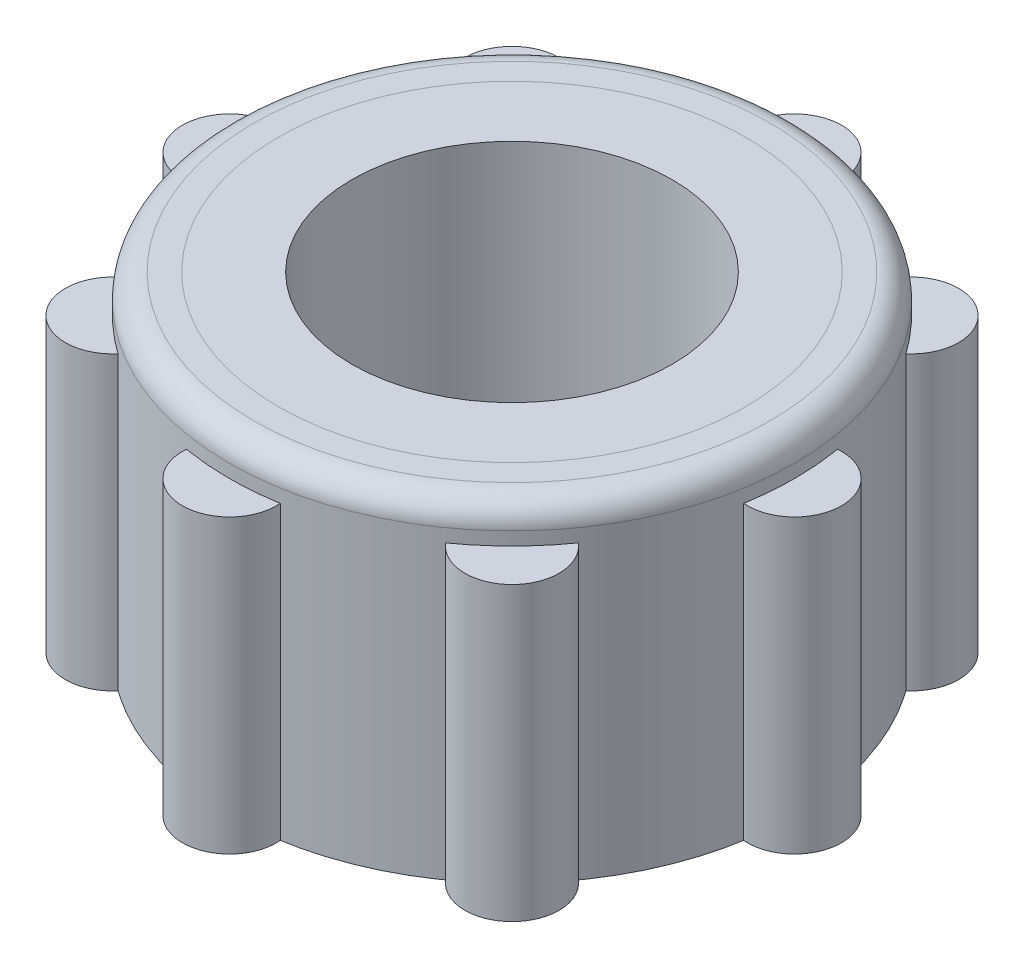
ISO-10303-21;
HEADER;
FILE_DESCRIPTION(('STEP AP214'),'2;1');
FILE_NAME('part.step','',(''),(''),'','','');
FILE_SCHEMA(('AUTOMOTIVE_DESIGN { 1 0 10303 214 1 1 1 1 }'));
ENDSEC;
DATA;
#1=APPLICATION_CONTEXT('core data for automotive mechanical design processes');
#2=APPLICATION_PROTOCOL_DEFINITION('international standard','automotive_design',2000,#1);
#3=PRODUCT_CONTEXT('',#1,'mechanical');
#4=PRODUCT('Part','Part','',(#3));
#5=PRODUCT_RELATED_PRODUCT_CATEGORY('part','',(#4));
#6=PRODUCT_DEFINITION_FORMATION('','',#4);
#7=PRODUCT_DEFINITION_CONTEXT('part definition',#1,'design');
#8=PRODUCT_DEFINITION('design','',#6,#7);
#9=PRODUCT_DEFINITION_SHAPE('','',#8);
#10=(LENGTH_UNIT() NAMED_UNIT(*) SI_UNIT(.MILLI.,.METRE.));
#11=(NAMED_UNIT(*) PLANE_ANGLE_UNIT() SI_UNIT($,.RADIAN.));
#12=(NAMED_UNIT(*) SI_UNIT($,.STERADIAN.) SOLID_ANGLE_UNIT());
#13=UNCERTAINTY_MEASURE_WITH_UNIT(LENGTH_MEASURE(1.E-05),#10,'distance_accuracy_value','');
#14=(GEOMETRIC_REPRESENTATION_CONTEXT(3) GLOBAL_UNCERTAINTY_ASSIGNED_CONTEXT((#13)) GLOBAL_UNIT_ASSIGNED_CONTEXT((#10,
#11,#12)) REPRESENTATION_CONTEXT('',''));
#15=CARTESIAN_POINT('',(0.,0.,0.));
#16=DIRECTION('',(0.,0.,1.));
#17=DIRECTION('',(1.,0.,0.));
#18=AXIS2_PLACEMENT_3D('',#15,#16,#17);
#19=CARTESIAN_POINT('',(0.,35.,0.));
#20=DIRECTION('',(0.,-1.,0.));
#21=DIRECTION('',(0.,0.,-1.));
#22=AXIS2_PLACEMENT_3D('',#19,#20,#21);
#23=CYLINDRICAL_SURFACE('',#22,17.);
#24=CARTESIAN_POINT('',(0.,35.,0.));
#25=DIRECTION('',(0.,1.,0.));
#26=DIRECTION('',(0.,0.,1.));
#27=AXIS2_PLACEMENT_3D('',#24,#25,#26);
#28=CIRCLE('',#27,17.);
#29=CARTESIAN_POINT('',(0.,35.,17.));
#30=VERTEX_POINT('',#29);
#31=EDGE_CURVE('E56',#30,#30,#28,.T.);
#32=ORIENTED_EDGE('',*,*,#31,.T.);
#33=EDGE_LOOP('',(#32));
#34=FACE_BOUND('',#33,.T.);
#35=CARTESIAN_POINT('',(0.,0.,0.));
#36=DIRECTION('',(0.,1.,0.));
#37=DIRECTION('',(0.,0.,1.));
#38=AXIS2_PLACEMENT_3D('',#35,#36,#37);
#39=CIRCLE('',#38,17.);
#40=CARTESIAN_POINT('',(0.,0.,17.));
#41=VERTEX_POINT('',#40);
#42=EDGE_CURVE('E63',#41,#41,#39,.T.);
#43=ORIENTED_EDGE('',*,*,#42,.F.);
#44=EDGE_LOOP('',(#43));
#45=FACE_BOUND('',#44,.T.);
#46=ADVANCED_FACE('F48',(#34,#45),#23,.F.);
#47=CARTESIAN_POINT('',(0.,35.,0.));
#48=DIRECTION('',(0.,-1.,0.));
#49=DIRECTION('',(0.,0.,-1.));
#50=AXIS2_PLACEMENT_3D('',#47,#48,#49);
#51=CYLINDRICAL_SURFACE('',#50,24.8);
#52=CARTESIAN_POINT('',(0.,35.,0.));
#53=DIRECTION('',(0.,1.,0.));
#54=DIRECTION('',(0.,0.,1.));
#55=AXIS2_PLACEMENT_3D('',#52,#53,#54);
#56=CIRCLE('',#55,24.8);
#57=CARTESIAN_POINT('',(0.,35.,24.8));
#58=VERTEX_POINT('',#57);
#59=EDGE_CURVE('E11',#58,#58,#56,.T.);
#60=ORIENTED_EDGE('',*,*,#59,.F.);
#61=EDGE_LOOP('',(#60));
#62=FACE_BOUND('',#61,.T.);
#63=CARTESIAN_POINT('',(0.,0.,0.));
#64=DIRECTION('',(0.,1.,0.));
#65=DIRECTION('',(0.,0.,1.));
#66=AXIS2_PLACEMENT_3D('',#63,#64,#65);
#67=CIRCLE('',#66,24.8);
#68=CARTESIAN_POINT('',(0.,0.,24.8));
#69=VERTEX_POINT('',#68);
#70=EDGE_CURVE('E51',#69,#69,#67,.T.);
#71=ORIENTED_EDGE('',*,*,#70,.T.);
#72=EDGE_LOOP('',(#71));
#73=FACE_BOUND('',#72,.T.);
#74=ADVANCED_FACE('F72',(#62,#73),#51,.T.);
#75=CARTESIAN_POINT('',(0.,35.,0.));
#76=DIRECTION('',(0.,1.,0.));
#77=DIRECTION('',(0.,0.,1.));
#78=AXIS2_PLACEMENT_3D('',#75,#76,#77);
#79=PLANE('',#78);
#80=ORIENTED_EDGE('',*,*,#31,.F.);
#81=EDGE_LOOP('',(#80));
#82=FACE_BOUND('',#81,.T.);
#83=ORIENTED_EDGE('',*,*,#59,.T.);
#84=EDGE_LOOP('',(#83));
#85=FACE_BOUND('',#84,.T.);
#86=ADVANCED_FACE('F76',(#82,#85),#79,.T.);
#87=CARTESIAN_POINT('',(0.,0.,0.));
#88=DIRECTION('',(0.,1.,0.));
#89=DIRECTION('',(0.,0.,1.));
#90=AXIS2_PLACEMENT_3D('',#87,#88,#89);
#91=PLANE('',#90);
#92=ORIENTED_EDGE('',*,*,#42,.T.);
#93=EDGE_LOOP('',(#92));
#94=FACE_BOUND('',#93,.T.);
#95=ORIENTED_EDGE('',*,*,#70,.F.);
#96=EDGE_LOOP('',(#95));
#97=FACE_BOUND('',#96,.T.);
#98=ADVANCED_FACE('F74',(#94,#97),#91,.F.);
#99=CLOSED_SHELL('',(#46,#74,#86,#98));
#100=MANIFOLD_SOLID_BREP('B2',#99);
#101=CARTESIAN_POINT('',(0.,31.,0.));
#102=DIRECTION('',(0.,-1.,0.));
#103=DIRECTION('',(0.,0.,-1.));
#104=AXIS2_PLACEMENT_3D('',#101,#102,#103);
#105=CYLINDRICAL_SURFACE('',#104,30.);
#106=CARTESIAN_POINT('',(0.,0.,0.));
#107=DIRECTION('',(0.,1.,0.));
#108=DIRECTION('',(0.,0.,1.));
#109=AXIS2_PLACEMENT_3D('',#106,#107,#108);
#110=CIRCLE('',#109,30.);
#111=CARTESIAN_POINT('',(-17.3953392506671,0.,-24.441811969537));
#112=VERTEX_POINT('',#111);
#113=CARTESIAN_POINT('',(-24.441811969537,0.,-17.395339250667));
#114=VERTEX_POINT('',#113);
#115=EDGE_CURVE('E152',#112,#114,#110,.T.);
#116=ORIENTED_EDGE('',*,*,#115,.F.);
#117=DIRECTION('',(0.,-1.,0.));
#118=VECTOR('',#117,1.);
#119=CARTESIAN_POINT('',(-17.3953392506671,31.,-24.441811969537));
#120=LINE('',#119,#118);
#121=CARTESIAN_POINT('',(-17.3953392506671,31.,-24.441811969537));
#122=VERTEX_POINT('',#121);
#123=EDGE_CURVE('E46',#122,#112,#120,.T.);
#124=ORIENTED_EDGE('',*,*,#123,.F.);
#125=CARTESIAN_POINT('',(0.,31.,0.));
#126=DIRECTION('',(0.,1.,0.));
#127=DIRECTION('',(0.,0.,1.));
#128=AXIS2_PLACEMENT_3D('',#125,#126,#127);
#129=CIRCLE('',#128,30.);
#130=CARTESIAN_POINT('',(-24.441811969537,31.,-17.395339250667));
#131=VERTEX_POINT('',#130);
#132=EDGE_CURVE('E153',#122,#131,#129,.T.);
#133=ORIENTED_EDGE('',*,*,#132,.T.);
#134=DIRECTION('',(0.,-1.,0.));
#135=VECTOR('',#134,1.);
#136=CARTESIAN_POINT('',(-24.441811969537,31.,-17.395339250667));
#137=LINE('',#136,#135);
#138=EDGE_CURVE('E132',#131,#114,#137,.T.);
#139=ORIENTED_EDGE('',*,*,#138,.T.);
#140=EDGE_LOOP('',(#116,#124,#133,#139));
#141=FACE_BOUND('',#140,.T.);
#142=ADVANCED_FACE('F124',(#141),#105,.F.);
#143=CARTESIAN_POINT('',(-21.2132034355965,31.,-21.2132034355964));
#144=DIRECTION('',(0.,-1.,0.));
#145=DIRECTION('',(0.,0.,-1.));
#146=AXIS2_PLACEMENT_3D('',#143,#144,#145);
#147=CYLINDRICAL_SURFACE('',#146,5.00000000000002);
#148=CARTESIAN_POINT('',(-21.2132034355965,0.,-21.2132034355964));
#149=DIRECTION('',(0.,1.,0.));
#150=DIRECTION('',(0.,0.,1.));
#151=AXIS2_PLACEMENT_3D('',#148,#149,#150);
#152=CIRCLE('',#151,5.00000000000002);
#153=EDGE_CURVE('E154',#112,#114,#152,.T.);
#154=ORIENTED_EDGE('',*,*,#153,.T.);
#155=ORIENTED_EDGE('',*,*,#138,.F.);
#156=CARTESIAN_POINT('',(-21.2132034355965,31.,-21.2132034355964));
#157=DIRECTION('',(0.,1.,0.));
#158=DIRECTION('',(0.,0.,1.));
#159=AXIS2_PLACEMENT_3D('',#156,#157,#158);
#160=CIRCLE('',#159,5.00000000000002);
#161=EDGE_CURVE('E139',#122,#131,#160,.T.);
#162=ORIENTED_EDGE('',*,*,#161,.F.);
#163=ORIENTED_EDGE('',*,*,#123,.T.);
#164=EDGE_LOOP('',(#154,#155,#162,#163));
#165=FACE_BOUND('',#164,.T.);
#166=ADVANCED_FACE('F155',(#165),#147,.T.);
#167=CARTESIAN_POINT('',(0.,31.,0.));
#168=DIRECTION('',(0.,1.,0.));
#169=DIRECTION('',(0.,0.,1.));
#170=AXIS2_PLACEMENT_3D('',#167,#168,#169);
#171=PLANE('',#170);
#172=ORIENTED_EDGE('',*,*,#132,.F.);
#173=ORIENTED_EDGE('',*,*,#161,.T.);
#174=EDGE_LOOP('',(#172,#173));
#175=FACE_BOUND('',#174,.T.);
#176=ADVANCED_FACE('F163',(#175),#171,.T.);
#177=CARTESIAN_POINT('',(0.,0.,0.));
#178=DIRECTION('',(0.,1.,0.));
#179=DIRECTION('',(0.,0.,1.));
#180=AXIS2_PLACEMENT_3D('',#177,#178,#179);
#181=PLANE('',#180);
#182=ORIENTED_EDGE('',*,*,#115,.T.);
#183=ORIENTED_EDGE('',*,*,#153,.F.);
#184=EDGE_LOOP('',(#182,#183));
#185=FACE_BOUND('',#184,.T.);
#186=ADVANCED_FACE('F158',(#185),#181,.F.);
#187=CLOSED_SHELL('',(#142,#166,#176,#186));
#188=MANIFOLD_SOLID_BREP('B6',#187);
#189=CARTESIAN_POINT('',(0.,31.,0.));
#190=DIRECTION('',(0.,-1.,0.));
#191=DIRECTION('',(0.,0.,-1.));
#192=AXIS2_PLACEMENT_3D('',#189,#190,#191);
#193=CYLINDRICAL_SURFACE('',#192,30.);
#194=CARTESIAN_POINT('',(0.,0.,0.));
#195=DIRECTION('',(0.,1.,0.));
#196=DIRECTION('',(0.,0.,1.));
#197=AXIS2_PLACEMENT_3D('',#194,#195,#196);
#198=CIRCLE('',#197,30.);
#199=CARTESIAN_POINT('',(-29.5833333333333,0.,-4.98260864295883));
#200=VERTEX_POINT('',#199);
#201=CARTESIAN_POINT('',(-29.5833333333333,0.,4.98260864295904));
#202=VERTEX_POINT('',#201);
#203=EDGE_CURVE('E243',#200,#202,#198,.T.);
#204=ORIENTED_EDGE('',*,*,#203,.F.);
#205=DIRECTION('',(0.,-1.,0.));
#206=VECTOR('',#205,1.);
#207=CARTESIAN_POINT('',(-29.5833333333333,31.,-4.98260864295883));
#208=LINE('',#207,#206);
#209=CARTESIAN_POINT('',(-29.5833333333333,31.,-4.98260864295883));
#210=VERTEX_POINT('',#209);
#211=EDGE_CURVE('E122',#210,#200,#208,.T.);
#212=ORIENTED_EDGE('',*,*,#211,.F.);
#213=CARTESIAN_POINT('',(0.,31.,0.));
#214=DIRECTION('',(0.,1.,0.));
#215=DIRECTION('',(0.,0.,1.));
#216=AXIS2_PLACEMENT_3D('',#213,#214,#215);
#217=CIRCLE('',#216,30.);
#218=CARTESIAN_POINT('',(-29.5833333333333,31.,4.98260864295904));
#219=VERTEX_POINT('',#218);
#220=EDGE_CURVE('E244',#210,#219,#217,.T.);
#221=ORIENTED_EDGE('',*,*,#220,.T.);
#222=DIRECTION('',(0.,-1.,0.));
#223=VECTOR('',#222,1.);
#224=CARTESIAN_POINT('',(-29.5833333333333,31.,4.98260864295904));
#225=LINE('',#224,#223);
#226=EDGE_CURVE('E223',#219,#202,#225,.T.);
#227=ORIENTED_EDGE('',*,*,#226,.T.);
#228=EDGE_LOOP('',(#204,#212,#221,#227));
#229=FACE_BOUND('',#228,.T.);
#230=ADVANCED_FACE('F215',(#229),#193,.F.);
#231=CARTESIAN_POINT('',(-30.,31.,1.04744440165294E-13));
#232=DIRECTION('',(0.,-1.,0.));
#233=DIRECTION('',(0.,0.,-1.));
#234=AXIS2_PLACEMENT_3D('',#231,#232,#233);
#235=CYLINDRICAL_SURFACE('',#234,5.00000000000002);
#236=CARTESIAN_POINT('',(-30.,0.,1.04744440165294E-13));
#237=DIRECTION('',(0.,1.,0.));
#238=DIRECTION('',(0.,0.,1.));
#239=AXIS2_PLACEMENT_3D('',#236,#237,#238);
#240=CIRCLE('',#239,5.00000000000002);
#241=EDGE_CURVE('E245',#200,#202,#240,.T.);
#242=ORIENTED_EDGE('',*,*,#241,.T.);
#243=ORIENTED_EDGE('',*,*,#226,.F.);
#244=CARTESIAN_POINT('',(-30.,31.,1.04744440165294E-13));
#245=DIRECTION('',(0.,1.,0.));
#246=DIRECTION('',(0.,0.,1.));
#247=AXIS2_PLACEMENT_3D('',#244,#245,#246);
#248=CIRCLE('',#247,5.00000000000002);
#249=EDGE_CURVE('E230',#210,#219,#248,.T.);
#250=ORIENTED_EDGE('',*,*,#249,.F.);
#251=ORIENTED_EDGE('',*,*,#211,.T.);
#252=EDGE_LOOP('',(#242,#243,#250,#251));
#253=FACE_BOUND('',#252,.T.);
#254=ADVANCED_FACE('F246',(#253),#235,.T.);
#255=CARTESIAN_POINT('',(0.,31.,0.));
#256=DIRECTION('',(0.,1.,0.));
#257=DIRECTION('',(0.,0.,1.));
#258=AXIS2_PLACEMENT_3D('',#255,#256,#257);
#259=PLANE('',#258);
#260=ORIENTED_EDGE('',*,*,#220,.F.);
#261=ORIENTED_EDGE('',*,*,#249,.T.);
#262=EDGE_LOOP('',(#260,#261));
#263=FACE_BOUND('',#262,.T.);
#264=ADVANCED_FACE('F254',(#263),#259,.T.);
#265=CARTESIAN_POINT('',(0.,0.,0.));
#266=DIRECTION('',(0.,1.,0.));
#267=DIRECTION('',(0.,0.,1.));
#268=AXIS2_PLACEMENT_3D('',#265,#266,#267);
#269=PLANE('',#268);
#270=ORIENTED_EDGE('',*,*,#203,.T.);
#271=ORIENTED_EDGE('',*,*,#241,.F.);
#272=EDGE_LOOP('',(#270,#271));
#273=FACE_BOUND('',#272,.T.);
#274=ADVANCED_FACE('F249',(#273),#269,.F.);
#275=CLOSED_SHELL('',(#230,#254,#264,#274));
#276=MANIFOLD_SOLID_BREP('B40',#275);
#277=CARTESIAN_POINT('',(0.,31.,0.));
#278=DIRECTION('',(0.,-1.,0.));
#279=DIRECTION('',(0.,0.,-1.));
#280=AXIS2_PLACEMENT_3D('',#277,#278,#279);
#281=CYLINDRICAL_SURFACE('',#280,30.);
#282=CARTESIAN_POINT('',(0.,0.,0.));
#283=DIRECTION('',(0.,1.,0.));
#284=DIRECTION('',(0.,0.,1.));
#285=AXIS2_PLACEMENT_3D('',#282,#283,#284);
#286=CIRCLE('',#285,30.);
#287=CARTESIAN_POINT('',(4.98260864295894,0.,-29.5833333333333));
#288=VERTEX_POINT('',#287);
#289=CARTESIAN_POINT('',(-4.98260864295894,0.,-29.5833333333333));
#290=VERTEX_POINT('',#289);
#291=EDGE_CURVE('E334',#288,#290,#286,.T.);
#292=ORIENTED_EDGE('',*,*,#291,.F.);
#293=DIRECTION('',(0.,-1.,0.));
#294=VECTOR('',#293,1.);
#295=CARTESIAN_POINT('',(4.98260864295894,31.,-29.5833333333333));
#296=LINE('',#295,#294);
#297=CARTESIAN_POINT('',(4.98260864295894,31.,-29.5833333333333));
#298=VERTEX_POINT('',#297);
#299=EDGE_CURVE('E213',#298,#288,#296,.T.);
#300=ORIENTED_EDGE('',*,*,#299,.F.);
#301=CARTESIAN_POINT('',(0.,31.,0.));
#302=DIRECTION('',(0.,1.,0.));
#303=DIRECTION('',(0.,0.,1.));
#304=AXIS2_PLACEMENT_3D('',#301,#302,#303);
#305=CIRCLE('',#304,30.);
#306=CARTESIAN_POINT('',(-4.98260864295894,31.,-29.5833333333333));
#307=VERTEX_POINT('',#306);
#308=EDGE_CURVE('E335',#298,#307,#305,.T.);
#309=ORIENTED_EDGE('',*,*,#308,.T.);
#310=DIRECTION('',(0.,-1.,0.));
#311=VECTOR('',#310,1.);
#312=CARTESIAN_POINT('',(-4.98260864295894,31.,-29.5833333333333));
#313=LINE('',#312,#311);
#314=EDGE_CURVE('E314',#307,#290,#313,.T.);
#315=ORIENTED_EDGE('',*,*,#314,.T.);
#316=EDGE_LOOP('',(#292,#300,#309,#315));
#317=FACE_BOUND('',#316,.T.);
#318=ADVANCED_FACE('F306',(#317),#281,.F.);
#319=CARTESIAN_POINT('',(0.,31.,-30.));
#320=DIRECTION('',(0.,-1.,0.));
#321=DIRECTION('',(0.,0.,-1.));
#322=AXIS2_PLACEMENT_3D('',#319,#320,#321);
#323=CYLINDRICAL_SURFACE('',#322,5.00000000000002);
#324=CARTESIAN_POINT('',(0.,0.,-30.));
#325=DIRECTION('',(0.,1.,0.));
#326=DIRECTION('',(0.,0.,1.));
#327=AXIS2_PLACEMENT_3D('',#324,#325,#326);
#328=CIRCLE('',#327,5.00000000000002);
#329=EDGE_CURVE('E336',#288,#290,#328,.T.);
#330=ORIENTED_EDGE('',*,*,#329,.T.);
#331=ORIENTED_EDGE('',*,*,#314,.F.);
#332=CARTESIAN_POINT('',(0.,31.,-30.));
#333=DIRECTION('',(0.,1.,0.));
#334=DIRECTION('',(0.,0.,1.));
#335=AXIS2_PLACEMENT_3D('',#332,#333,#334);
#336=CIRCLE('',#335,5.00000000000002);
#337=EDGE_CURVE('E321',#298,#307,#336,.T.);
#338=ORIENTED_EDGE('',*,*,#337,.F.);
#339=ORIENTED_EDGE('',*,*,#299,.T.);
#340=EDGE_LOOP('',(#330,#331,#338,#339));
#341=FACE_BOUND('',#340,.T.);
#342=ADVANCED_FACE('F337',(#341),#323,.T.);
#343=CARTESIAN_POINT('',(0.,31.,0.));
#344=DIRECTION('',(0.,1.,0.));
#345=DIRECTION('',(0.,0.,1.));
#346=AXIS2_PLACEMENT_3D('',#343,#344,#345);
#347=PLANE('',#346);
#348=ORIENTED_EDGE('',*,*,#308,.F.);
#349=ORIENTED_EDGE('',*,*,#337,.T.);
#350=EDGE_LOOP('',(#348,#349));
#351=FACE_BOUND('',#350,.T.);
#352=ADVANCED_FACE('F345',(#351),#347,.T.);
#353=CARTESIAN_POINT('',(0.,0.,0.));
#354=DIRECTION('',(0.,1.,0.));
#355=DIRECTION('',(0.,0.,1.));
#356=AXIS2_PLACEMENT_3D('',#353,#354,#355);
#357=PLANE('',#356);
#358=ORIENTED_EDGE('',*,*,#291,.T.);
#359=ORIENTED_EDGE('',*,*,#329,.F.);
#360=EDGE_LOOP('',(#358,#359));
#361=FACE_BOUND('',#360,.T.);
#362=ADVANCED_FACE('F340',(#361),#357,.F.);
#363=CLOSED_SHELL('',(#318,#342,#352,#362));
#364=MANIFOLD_SOLID_BREP('B116',#363);
#365=CARTESIAN_POINT('',(0.,31.,0.));
#366=DIRECTION('',(0.,-1.,0.));
#367=DIRECTION('',(0.,0.,-1.));
#368=AXIS2_PLACEMENT_3D('',#365,#366,#367);
#369=CYLINDRICAL_SURFACE('',#368,30.);
#370=CARTESIAN_POINT('',(0.,0.,0.));
#371=DIRECTION('',(0.,1.,0.));
#372=DIRECTION('',(0.,0.,1.));
#373=AXIS2_PLACEMENT_3D('',#370,#371,#372);
#374=CIRCLE('',#373,30.);
#375=CARTESIAN_POINT('',(-24.4418119695371,0.,17.3953392506668));
#376=VERTEX_POINT('',#375);
#377=CARTESIAN_POINT('',(-17.3953392506673,0.,24.4418119695368));
#378=VERTEX_POINT('',#377);
#379=EDGE_CURVE('E425',#376,#378,#374,.T.);
#380=ORIENTED_EDGE('',*,*,#379,.F.);
#381=DIRECTION('',(0.,-1.,0.));
#382=VECTOR('',#381,1.);
#383=CARTESIAN_POINT('',(-24.4418119695371,31.,17.3953392506668));
#384=LINE('',#383,#382);
#385=CARTESIAN_POINT('',(-24.4418119695371,31.,17.3953392506668));
#386=VERTEX_POINT('',#385);
#387=EDGE_CURVE('E304',#386,#376,#384,.T.);
#388=ORIENTED_EDGE('',*,*,#387,.F.);
#389=CARTESIAN_POINT('',(0.,31.,0.));
#390=DIRECTION('',(0.,1.,0.));
#391=DIRECTION('',(0.,0.,1.));
#392=AXIS2_PLACEMENT_3D('',#389,#390,#391);
#393=CIRCLE('',#392,30.);
#394=CARTESIAN_POINT('',(-17.3953392506673,31.,24.4418119695368));
#395=VERTEX_POINT('',#394);
#396=EDGE_CURVE('E426',#386,#395,#393,.T.);
#397=ORIENTED_EDGE('',*,*,#396,.T.);
#398=DIRECTION('',(0.,-1.,0.));
#399=VECTOR('',#398,1.);
#400=CARTESIAN_POINT('',(-17.3953392506673,31.,24.4418119695368));
#401=LINE('',#400,#399);
#402=EDGE_CURVE('E405',#395,#378,#401,.T.);
#403=ORIENTED_EDGE('',*,*,#402,.T.);
#404=EDGE_LOOP('',(#380,#388,#397,#403));
#405=FACE_BOUND('',#404,.T.);
#406=ADVANCED_FACE('F397',(#405),#369,.F.);
#407=CARTESIAN_POINT('',(-21.2132034355966,31.,21.2132034355962));
#408=DIRECTION('',(0.,-1.,0.));
#409=DIRECTION('',(0.,0.,-1.));
#410=AXIS2_PLACEMENT_3D('',#407,#408,#409);
#411=CYLINDRICAL_SURFACE('',#410,5.00000000000002);
#412=CARTESIAN_POINT('',(-21.2132034355966,0.,21.2132034355962));
#413=DIRECTION('',(0.,1.,0.));
#414=DIRECTION('',(0.,0.,1.));
#415=AXIS2_PLACEMENT_3D('',#412,#413,#414);
#416=CIRCLE('',#415,5.00000000000002);
#417=EDGE_CURVE('E427',#376,#378,#416,.T.);
#418=ORIENTED_EDGE('',*,*,#417,.T.);
#419=ORIENTED_EDGE('',*,*,#402,.F.);
#420=CARTESIAN_POINT('',(-21.2132034355966,31.,21.2132034355962));
#421=DIRECTION('',(0.,1.,0.));
#422=DIRECTION('',(0.,0.,1.));
#423=AXIS2_PLACEMENT_3D('',#420,#421,#422);
#424=CIRCLE('',#423,5.00000000000002);
#425=EDGE_CURVE('E412',#386,#395,#424,.T.);
#426=ORIENTED_EDGE('',*,*,#425,.F.);
#427=ORIENTED_EDGE('',*,*,#387,.T.);
#428=EDGE_LOOP('',(#418,#419,#426,#427));
#429=FACE_BOUND('',#428,.T.);
#430=ADVANCED_FACE('F428',(#429),#411,.T.);
#431=CARTESIAN_POINT('',(0.,31.,0.));
#432=DIRECTION('',(0.,1.,0.));
#433=DIRECTION('',(0.,0.,1.));
#434=AXIS2_PLACEMENT_3D('',#431,#432,#433);
#435=PLANE('',#434);
#436=ORIENTED_EDGE('',*,*,#396,.F.);
#437=ORIENTED_EDGE('',*,*,#425,.T.);
#438=EDGE_LOOP('',(#436,#437));
#439=FACE_BOUND('',#438,.T.);
#440=ADVANCED_FACE('F436',(#439),#435,.T.);
#441=CARTESIAN_POINT('',(0.,0.,0.));
#442=DIRECTION('',(0.,1.,0.));
#443=DIRECTION('',(0.,0.,1.));
#444=AXIS2_PLACEMENT_3D('',#441,#442,#443);
#445=PLANE('',#444);
#446=ORIENTED_EDGE('',*,*,#379,.T.);
#447=ORIENTED_EDGE('',*,*,#417,.F.);
#448=EDGE_LOOP('',(#446,#447));
#449=FACE_BOUND('',#448,.T.);
#450=ADVANCED_FACE('F431',(#449),#445,.F.);
#451=CLOSED_SHELL('',(#406,#430,#440,#450));
#452=MANIFOLD_SOLID_BREP('B207',#451);
#453=CARTESIAN_POINT('',(0.,31.,0.));
#454=DIRECTION('',(0.,-1.,0.));
#455=DIRECTION('',(0.,0.,-1.));
#456=AXIS2_PLACEMENT_3D('',#453,#454,#455);
#457=CYLINDRICAL_SURFACE('',#456,30.);
#458=CARTESIAN_POINT('',(0.,0.,0.));
#459=DIRECTION('',(0.,1.,0.));
#460=DIRECTION('',(0.,0.,1.));
#461=AXIS2_PLACEMENT_3D('',#458,#459,#460);
#462=CIRCLE('',#461,30.);
#463=CARTESIAN_POINT('',(24.4418119695369,0.,-17.3953392506672));
#464=VERTEX_POINT('',#463);
#465=CARTESIAN_POINT('',(17.395339250667,0.,-24.4418119695371));
#466=VERTEX_POINT('',#465);
#467=EDGE_CURVE('E516',#464,#466,#462,.T.);
#468=ORIENTED_EDGE('',*,*,#467,.F.);
#469=DIRECTION('',(0.,-1.,0.));
#470=VECTOR('',#469,1.);
#471=CARTESIAN_POINT('',(24.4418119695369,31.,-17.3953392506672));
#472=LINE('',#471,#470);
#473=CARTESIAN_POINT('',(24.4418119695369,31.,-17.3953392506672));
#474=VERTEX_POINT('',#473);
#475=EDGE_CURVE('E395',#474,#464,#472,.T.);
#476=ORIENTED_EDGE('',*,*,#475,.F.);
#477=CARTESIAN_POINT('',(0.,31.,0.));
#478=DIRECTION('',(0.,1.,0.));
#479=DIRECTION('',(0.,0.,1.));
#480=AXIS2_PLACEMENT_3D('',#477,#478,#479);
#481=CIRCLE('',#480,30.);
#482=CARTESIAN_POINT('',(17.395339250667,31.,-24.4418119695371));
#483=VERTEX_POINT('',#482);
#484=EDGE_CURVE('E517',#474,#483,#481,.T.);
#485=ORIENTED_EDGE('',*,*,#484,.T.);
#486=DIRECTION('',(0.,-1.,0.));
#487=VECTOR('',#486,1.);
#488=CARTESIAN_POINT('',(17.395339250667,31.,-24.4418119695371));
#489=LINE('',#488,#487);
#490=EDGE_CURVE('E496',#483,#466,#489,.T.);
#491=ORIENTED_EDGE('',*,*,#490,.T.);
#492=EDGE_LOOP('',(#468,#476,#485,#491));
#493=FACE_BOUND('',#492,.T.);
#494=ADVANCED_FACE('F488',(#493),#457,.F.);
#495=CARTESIAN_POINT('',(21.2132034355957,31.,-21.2132034355959));
#496=DIRECTION('',(0.,-1.,0.));
#497=DIRECTION('',(0.,0.,-1.));
#498=AXIS2_PLACEMENT_3D('',#495,#496,#497);
#499=CYLINDRICAL_SURFACE('',#498,4.99999999999995);
#500=CARTESIAN_POINT('',(21.2132034355957,0.,-21.2132034355959));
#501=DIRECTION('',(0.,1.,0.));
#502=DIRECTION('',(0.,0.,1.));
#503=AXIS2_PLACEMENT_3D('',#500,#501,#502);
#504=CIRCLE('',#503,4.99999999999995);
#505=EDGE_CURVE('E518',#464,#466,#504,.T.);
#506=ORIENTED_EDGE('',*,*,#505,.T.);
#507=ORIENTED_EDGE('',*,*,#490,.F.);
#508=CARTESIAN_POINT('',(21.2132034355957,31.,-21.2132034355959));
#509=DIRECTION('',(0.,1.,0.));
#510=DIRECTION('',(0.,0.,1.));
#511=AXIS2_PLACEMENT_3D('',#508,#509,#510);
#512=CIRCLE('',#511,4.99999999999995);
#513=EDGE_CURVE('E503',#474,#483,#512,.T.);
#514=ORIENTED_EDGE('',*,*,#513,.F.);
#515=ORIENTED_EDGE('',*,*,#475,.T.);
#516=EDGE_LOOP('',(#506,#507,#514,#515));
#517=FACE_BOUND('',#516,.T.);
#518=ADVANCED_FACE('F519',(#517),#499,.T.);
#519=CARTESIAN_POINT('',(0.,31.,0.));
#520=DIRECTION('',(0.,1.,0.));
#521=DIRECTION('',(0.,0.,1.));
#522=AXIS2_PLACEMENT_3D('',#519,#520,#521);
#523=PLANE('',#522);
#524=ORIENTED_EDGE('',*,*,#484,.F.);
#525=ORIENTED_EDGE('',*,*,#513,.T.);
#526=EDGE_LOOP('',(#524,#525));
#527=FACE_BOUND('',#526,.T.);
#528=ADVANCED_FACE('F527',(#527),#523,.T.);
#529=CARTESIAN_POINT('',(0.,0.,0.));
#530=DIRECTION('',(0.,1.,0.));
#531=DIRECTION('',(0.,0.,1.));
#532=AXIS2_PLACEMENT_3D('',#529,#530,#531);
#533=PLANE('',#532);
#534=ORIENTED_EDGE('',*,*,#467,.T.);
#535=ORIENTED_EDGE('',*,*,#505,.F.);
#536=EDGE_LOOP('',(#534,#535));
#537=FACE_BOUND('',#536,.T.);
#538=ADVANCED_FACE('F522',(#537),#533,.F.);
#539=CLOSED_SHELL('',(#494,#518,#528,#538));
#540=MANIFOLD_SOLID_BREP('B298',#539);
#541=CARTESIAN_POINT('',(0.,31.,0.));
#542=DIRECTION('',(0.,-1.,0.));
#543=DIRECTION('',(0.,0.,-1.));
#544=AXIS2_PLACEMENT_3D('',#541,#542,#543);
#545=CYLINDRICAL_SURFACE('',#544,30.);
#546=CARTESIAN_POINT('',(0.,0.,0.));
#547=DIRECTION('',(0.,1.,0.));
#548=DIRECTION('',(0.,0.,1.));
#549=AXIS2_PLACEMENT_3D('',#546,#547,#548);
#550=CIRCLE('',#549,30.);
#551=CARTESIAN_POINT('',(29.5833333333333,0.,4.98260864295919));
#552=VERTEX_POINT('',#551);
#553=CARTESIAN_POINT('',(29.5833333333334,0.,-4.98260864295869));
#554=VERTEX_POINT('',#553);
#555=EDGE_CURVE('E607',#552,#554,#550,.T.);
#556=ORIENTED_EDGE('',*,*,#555,.F.);
#557=DIRECTION('',(0.,-1.,0.));
#558=VECTOR('',#557,1.);
#559=CARTESIAN_POINT('',(29.5833333333333,31.,4.98260864295919));
#560=LINE('',#559,#558);
#561=CARTESIAN_POINT('',(29.5833333333333,31.,4.98260864295919));
#562=VERTEX_POINT('',#561);
#563=EDGE_CURVE('E486',#562,#552,#560,.T.);
#564=ORIENTED_EDGE('',*,*,#563,.F.);
#565=CARTESIAN_POINT('',(0.,31.,0.));
#566=DIRECTION('',(0.,1.,0.));
#567=DIRECTION('',(0.,0.,1.));
#568=AXIS2_PLACEMENT_3D('',#565,#566,#567);
#569=CIRCLE('',#568,30.);
#570=CARTESIAN_POINT('',(29.5833333333334,31.,-4.98260864295869));
#571=VERTEX_POINT('',#570);
#572=EDGE_CURVE('E608',#562,#571,#569,.T.);
#573=ORIENTED_EDGE('',*,*,#572,.T.);
#574=DIRECTION('',(0.,-1.,0.));
#575=VECTOR('',#574,1.);
#576=CARTESIAN_POINT('',(29.5833333333334,31.,-4.98260864295869));
#577=LINE('',#576,#575);
#578=EDGE_CURVE('E587',#571,#554,#577,.T.);
#579=ORIENTED_EDGE('',*,*,#578,.T.);
#580=EDGE_LOOP('',(#556,#564,#573,#579));
#581=FACE_BOUND('',#580,.T.);
#582=ADVANCED_FACE('F579',(#581),#545,.F.);
#583=CARTESIAN_POINT('',(29.9999999999982,31.,2.55016460767879E-13));
#584=DIRECTION('',(0.,-1.,0.));
#585=DIRECTION('',(0.,0.,-1.));
#586=AXIS2_PLACEMENT_3D('',#583,#584,#585);
#587=CYLINDRICAL_SURFACE('',#586,4.99999999999987);
#588=CARTESIAN_POINT('',(29.9999999999982,0.,2.55016460767879E-13));
#589=DIRECTION('',(0.,1.,0.));
#590=DIRECTION('',(0.,0.,1.));
#591=AXIS2_PLACEMENT_3D('',#588,#589,#590);
#592=CIRCLE('',#591,4.99999999999987);
#593=EDGE_CURVE('E609',#552,#554,#592,.T.);
#594=ORIENTED_EDGE('',*,*,#593,.T.);
#595=ORIENTED_EDGE('',*,*,#578,.F.);
#596=CARTESIAN_POINT('',(29.9999999999982,31.,2.55016460767879E-13));
#597=DIRECTION('',(0.,1.,0.));
#598=DIRECTION('',(0.,0.,1.));
#599=AXIS2_PLACEMENT_3D('',#596,#597,#598);
#600=CIRCLE('',#599,4.99999999999987);
#601=EDGE_CURVE('E594',#562,#571,#600,.T.);
#602=ORIENTED_EDGE('',*,*,#601,.F.);
#603=ORIENTED_EDGE('',*,*,#563,.T.);
#604=EDGE_LOOP('',(#594,#595,#602,#603));
#605=FACE_BOUND('',#604,.T.);
#606=ADVANCED_FACE('F610',(#605),#587,.T.);
#607=CARTESIAN_POINT('',(0.,31.,0.));
#608=DIRECTION('',(0.,1.,0.));
#609=DIRECTION('',(0.,0.,1.));
#610=AXIS2_PLACEMENT_3D('',#607,#608,#609);
#611=PLANE('',#610);
#612=ORIENTED_EDGE('',*,*,#572,.F.);
#613=ORIENTED_EDGE('',*,*,#601,.T.);
#614=EDGE_LOOP('',(#612,#613));
#615=FACE_BOUND('',#614,.T.);
#616=ADVANCED_FACE('F618',(#615),#611,.T.);
#617=CARTESIAN_POINT('',(0.,0.,0.));
#618=DIRECTION('',(0.,1.,0.));
#619=DIRECTION('',(0.,0.,1.));
#620=AXIS2_PLACEMENT_3D('',#617,#618,#619);
#621=PLANE('',#620);
#622=ORIENTED_EDGE('',*,*,#555,.T.);
#623=ORIENTED_EDGE('',*,*,#593,.F.);
#624=EDGE_LOOP('',(#622,#623));
#625=FACE_BOUND('',#624,.T.);
#626=ADVANCED_FACE('F613',(#625),#621,.F.);
#627=CLOSED_SHELL('',(#582,#606,#616,#626));
#628=MANIFOLD_SOLID_BREP('B389',#627);
#629=CARTESIAN_POINT('',(0.,31.,0.));
#630=DIRECTION('',(0.,-1.,0.));
#631=DIRECTION('',(0.,0.,-1.));
#632=AXIS2_PLACEMENT_3D('',#629,#630,#631);
#633=CYLINDRICAL_SURFACE('',#632,30.);
#634=CARTESIAN_POINT('',(0.,0.,0.));
#635=DIRECTION('',(0.,1.,0.));
#636=DIRECTION('',(0.,0.,1.));
#637=AXIS2_PLACEMENT_3D('',#634,#635,#636);
#638=CIRCLE('',#637,30.);
#639=CARTESIAN_POINT('',(17.3953392506669,0.,24.4418119695371));
#640=VERTEX_POINT('',#639);
#641=CARTESIAN_POINT('',(24.4418119695369,0.,17.3953392506672));
#642=VERTEX_POINT('',#641);
#643=EDGE_CURVE('E701',#640,#642,#638,.T.);
#644=ORIENTED_EDGE('',*,*,#643,.F.);
#645=DIRECTION('',(0.,-1.,0.));
#646=VECTOR('',#645,1.);
#647=CARTESIAN_POINT('',(17.3953392506669,31.,24.4418119695371));
#648=LINE('',#647,#646);
#649=CARTESIAN_POINT('',(17.3953392506669,31.,24.4418119695371));
#650=VERTEX_POINT('',#649);
#651=EDGE_CURVE('E577',#650,#640,#648,.T.);
#652=ORIENTED_EDGE('',*,*,#651,.F.);
#653=CARTESIAN_POINT('',(0.,31.,0.));
#654=DIRECTION('',(0.,1.,0.));
#655=DIRECTION('',(0.,0.,1.));
#656=AXIS2_PLACEMENT_3D('',#653,#654,#655);
#657=CIRCLE('',#656,30.);
#658=CARTESIAN_POINT('',(24.4418119695369,31.,17.3953392506672));
#659=VERTEX_POINT('',#658);
#660=EDGE_CURVE('E702',#650,#659,#657,.T.);
#661=ORIENTED_EDGE('',*,*,#660,.T.);
#662=DIRECTION('',(0.,-1.,0.));
#663=VECTOR('',#662,1.);
#664=CARTESIAN_POINT('',(24.4418119695369,31.,17.3953392506672));
#665=LINE('',#664,#663);
#666=EDGE_CURVE('E681',#659,#642,#665,.T.);
#667=ORIENTED_EDGE('',*,*,#666,.T.);
#668=EDGE_LOOP('',(#644,#652,#661,#667));
#669=FACE_BOUND('',#668,.T.);
#670=ADVANCED_FACE('F673',(#669),#633,.F.);
#671=CARTESIAN_POINT('',(21.2132034355963,31.,21.2132034355965));
#672=DIRECTION('',(0.,-1.,0.));
#673=DIRECTION('',(0.,0.,-1.));
#674=AXIS2_PLACEMENT_3D('',#671,#672,#673);
#675=CYLINDRICAL_SURFACE('',#674,5.00000000000002);
#676=CARTESIAN_POINT('',(21.2132034355963,0.,21.2132034355965));
#677=DIRECTION('',(0.,1.,0.));
#678=DIRECTION('',(0.,0.,1.));
#679=AXIS2_PLACEMENT_3D('',#676,#677,#678);
#680=CIRCLE('',#679,5.00000000000002);
#681=EDGE_CURVE('E703',#640,#642,#680,.T.);
#682=ORIENTED_EDGE('',*,*,#681,.T.);
#683=ORIENTED_EDGE('',*,*,#666,.F.);
#684=CARTESIAN_POINT('',(21.2132034355963,31.,21.2132034355965));
#685=DIRECTION('',(0.,1.,0.));
#686=DIRECTION('',(0.,0.,1.));
#687=AXIS2_PLACEMENT_3D('',#684,#685,#686);
#688=CIRCLE('',#687,5.00000000000002);
#689=EDGE_CURVE('E688',#650,#659,#688,.T.);
#690=ORIENTED_EDGE('',*,*,#689,.F.);
#691=ORIENTED_EDGE('',*,*,#651,.T.);
#692=EDGE_LOOP('',(#682,#683,#690,#691));
#693=FACE_BOUND('',#692,.T.);
#694=ADVANCED_FACE('F704',(#693),#675,.T.);
#695=CARTESIAN_POINT('',(0.,31.,0.));
#696=DIRECTION('',(0.,1.,0.));
#697=DIRECTION('',(0.,0.,1.));
#698=AXIS2_PLACEMENT_3D('',#695,#696,#697);
#699=PLANE('',#698);
#700=ORIENTED_EDGE('',*,*,#660,.F.);
#701=ORIENTED_EDGE('',*,*,#689,.T.);
#702=EDGE_LOOP('',(#700,#701));
#703=FACE_BOUND('',#702,.T.);
#704=ADVANCED_FACE('F712',(#703),#699,.T.);
#705=CARTESIAN_POINT('',(0.,0.,0.));
#706=DIRECTION('',(0.,1.,0.));
#707=DIRECTION('',(0.,0.,1.));
#708=AXIS2_PLACEMENT_3D('',#705,#706,#707);
#709=PLANE('',#708);
#710=ORIENTED_EDGE('',*,*,#643,.T.);
#711=ORIENTED_EDGE('',*,*,#681,.F.);
#712=EDGE_LOOP('',(#710,#711));
#713=FACE_BOUND('',#712,.T.);
#714=ADVANCED_FACE('F707',(#713),#709,.F.);
#715=CLOSED_SHELL('',(#670,#694,#704,#714));
#716=MANIFOLD_SOLID_BREP('B480',#715);
#717=CARTESIAN_POINT('',(0.,31.,0.));
#718=DIRECTION('',(0.,-1.,0.));
#719=DIRECTION('',(0.,0.,-1.));
#720=AXIS2_PLACEMENT_3D('',#717,#718,#719);
#721=CYLINDRICAL_SURFACE('',#720,30.);
#722=CARTESIAN_POINT('',(0.,0.,0.));
#723=DIRECTION('',(0.,1.,0.));
#724=DIRECTION('',(0.,0.,1.));
#725=AXIS2_PLACEMENT_3D('',#722,#723,#724);
#726=CIRCLE('',#725,30.);
#727=CARTESIAN_POINT('',(-4.98260864295985,0.,29.5833333333332));
#728=VERTEX_POINT('',#727);
#729=CARTESIAN_POINT('',(4.98260864295881,0.,29.5833333333333));
#730=VERTEX_POINT('',#729);
#731=EDGE_CURVE('E789',#728,#730,#726,.T.);
#732=ORIENTED_EDGE('',*,*,#731,.F.);
#733=DIRECTION('',(0.,-1.,0.));
#734=VECTOR('',#733,1.);
#735=CARTESIAN_POINT('',(-4.98260864295985,31.,29.5833333333332));
#736=LINE('',#735,#734);
#737=CARTESIAN_POINT('',(-4.98260864295985,31.,29.5833333333332));
#738=VERTEX_POINT('',#737);
#739=EDGE_CURVE('E671',#738,#728,#736,.T.);
#740=ORIENTED_EDGE('',*,*,#739,.F.);
#741=CARTESIAN_POINT('',(0.,31.,0.));
#742=DIRECTION('',(0.,1.,0.));
#743=DIRECTION('',(0.,0.,1.));
#744=AXIS2_PLACEMENT_3D('',#741,#742,#743);
#745=CIRCLE('',#744,30.);
#746=CARTESIAN_POINT('',(4.98260864295881,31.,29.5833333333333));
#747=VERTEX_POINT('',#746);
#748=EDGE_CURVE('E790',#738,#747,#745,.T.);
#749=ORIENTED_EDGE('',*,*,#748,.T.);
#750=DIRECTION('',(0.,-1.,0.));
#751=VECTOR('',#750,1.);
#752=CARTESIAN_POINT('',(4.98260864295881,31.,29.5833333333333));
#753=LINE('',#752,#751);
#754=EDGE_CURVE('E769',#747,#730,#753,.T.);
#755=ORIENTED_EDGE('',*,*,#754,.T.);
#756=EDGE_LOOP('',(#732,#740,#749,#755));
#757=FACE_BOUND('',#756,.T.);
#758=ADVANCED_FACE('F761',(#757),#721,.F.);
#759=CARTESIAN_POINT('',(-5.22466115597048E-13,31.,30.0000000000086));
#760=DIRECTION('',(0.,-1.,0.));
#761=DIRECTION('',(0.,0.,-1.));
#762=AXIS2_PLACEMENT_3D('',#759,#760,#761);
#763=CYLINDRICAL_SURFACE('',#762,5.00000000000112);
#764=CARTESIAN_POINT('',(-5.22466115597048E-13,0.,30.0000000000086));
#765=DIRECTION('',(0.,1.,0.));
#766=DIRECTION('',(0.,0.,1.));
#767=AXIS2_PLACEMENT_3D('',#764,#765,#766);
#768=CIRCLE('',#767,5.00000000000112);
#769=EDGE_CURVE('E791',#728,#730,#768,.T.);
#770=ORIENTED_EDGE('',*,*,#769,.T.);
#771=ORIENTED_EDGE('',*,*,#754,.F.);
#772=CARTESIAN_POINT('',(-5.22466115597048E-13,31.,30.0000000000086));
#773=DIRECTION('',(0.,1.,0.));
#774=DIRECTION('',(0.,0.,1.));
#775=AXIS2_PLACEMENT_3D('',#772,#773,#774);
#776=CIRCLE('',#775,5.00000000000112);
#777=EDGE_CURVE('E776',#738,#747,#776,.T.);
#778=ORIENTED_EDGE('',*,*,#777,.F.);
#779=ORIENTED_EDGE('',*,*,#739,.T.);
#780=EDGE_LOOP('',(#770,#771,#778,#779));
#781=FACE_BOUND('',#780,.T.);
#782=ADVANCED_FACE('F792',(#781),#763,.T.);
#783=CARTESIAN_POINT('',(0.,31.,0.));
#784=DIRECTION('',(0.,1.,0.));
#785=DIRECTION('',(0.,0.,1.));
#786=AXIS2_PLACEMENT_3D('',#783,#784,#785);
#787=PLANE('',#786);
#788=ORIENTED_EDGE('',*,*,#748,.F.);
#789=ORIENTED_EDGE('',*,*,#777,.T.);
#790=EDGE_LOOP('',(#788,#789));
#791=FACE_BOUND('',#790,.T.);
#792=ADVANCED_FACE('F800',(#791),#787,.T.);
#793=CARTESIAN_POINT('',(0.,0.,0.));
#794=DIRECTION('',(0.,1.,0.));
#795=DIRECTION('',(0.,0.,1.));
#796=AXIS2_PLACEMENT_3D('',#793,#794,#795);
#797=PLANE('',#796);
#798=ORIENTED_EDGE('',*,*,#731,.T.);
#799=ORIENTED_EDGE('',*,*,#769,.F.);
#800=EDGE_LOOP('',(#798,#799));
#801=FACE_BOUND('',#800,.T.);
#802=ADVANCED_FACE('F795',(#801),#797,.F.);
#803=CLOSED_SHELL('',(#758,#782,#792,#802));
#804=MANIFOLD_SOLID_BREP('B571',#803);
#805=CARTESIAN_POINT('',(0.,35.,0.));
#806=DIRECTION('',(0.,-1.,0.));
#807=DIRECTION('',(0.,0.,-1.));
#808=AXIS2_PLACEMENT_3D('',#805,#806,#807);
#809=CYLINDRICAL_SURFACE('',#808,24.8);
#810=CARTESIAN_POINT('',(0.,35.,0.));
#811=DIRECTION('',(0.,1.,0.));
#812=DIRECTION('',(0.,0.,1.));
#813=AXIS2_PLACEMENT_3D('',#810,#811,#812);
#814=CIRCLE('',#813,24.8);
#815=CARTESIAN_POINT('',(0.,35.,24.8));
#816=VERTEX_POINT('',#815);
#817=EDGE_CURVE('E856',#816,#816,#814,.T.);
#818=ORIENTED_EDGE('',*,*,#817,.T.);
#819=EDGE_LOOP('',(#818));
#820=FACE_BOUND('',#819,.T.);
#821=CARTESIAN_POINT('',(0.,0.,0.));
#822=DIRECTION('',(0.,1.,0.));
#823=DIRECTION('',(0.,0.,1.));
#824=AXIS2_PLACEMENT_3D('',#821,#822,#823);
#825=CIRCLE('',#824,24.8);
#826=CARTESIAN_POINT('',(0.,0.,24.8));
#827=VERTEX_POINT('',#826);
#828=EDGE_CURVE('E865',#827,#827,#825,.T.);
#829=ORIENTED_EDGE('',*,*,#828,.F.);
#830=EDGE_LOOP('',(#829));
#831=FACE_BOUND('',#830,.T.);
#832=ADVANCED_FACE('F845',(#820,#831),#809,.F.);
#833=CARTESIAN_POINT('',(0.,35.,0.));
#834=DIRECTION('',(0.,-1.,0.));
#835=DIRECTION('',(0.,0.,-1.));
#836=AXIS2_PLACEMENT_3D('',#833,#834,#835);
#837=CYLINDRICAL_SURFACE('',#836,30.);
#838=CARTESIAN_POINT('',(0.,32.4,0.));
#839=DIRECTION('',(0.,1.,0.));
#840=DIRECTION('',(0.,0.,1.));
#841=AXIS2_PLACEMENT_3D('',#838,#839,#840);
#842=CIRCLE('',#841,30.);
#843=CARTESIAN_POINT('',(0.,32.4,30.));
#844=VERTEX_POINT('',#843);
#845=EDGE_CURVE('E760',#844,#844,#842,.F.);
#846=ORIENTED_EDGE('',*,*,#845,.T.);
#847=EDGE_LOOP('',(#846));
#848=FACE_BOUND('',#847,.T.);
#849=CARTESIAN_POINT('',(0.,0.,0.));
#850=DIRECTION('',(0.,1.,0.));
#851=DIRECTION('',(0.,0.,1.));
#852=AXIS2_PLACEMENT_3D('',#849,#850,#851);
#853=CIRCLE('',#852,30.);
#854=CARTESIAN_POINT('',(0.,0.,30.));
#855=VERTEX_POINT('',#854);
#856=EDGE_CURVE('E860',#855,#855,#853,.T.);
#857=ORIENTED_EDGE('',*,*,#856,.T.);
#858=EDGE_LOOP('',(#857));
#859=FACE_BOUND('',#858,.T.);
#860=ADVANCED_FACE('F873',(#848,#859),#837,.T.);
#861=CARTESIAN_POINT('',(0.,35.,0.));
#862=DIRECTION('',(0.,1.,0.));
#863=DIRECTION('',(0.,0.,1.));
#864=AXIS2_PLACEMENT_3D('',#861,#862,#863);
#865=PLANE('',#864);
#866=CARTESIAN_POINT('',(0.,35.,0.));
#867=DIRECTION('',(0.,1.,0.));
#868=DIRECTION('',(0.,0.,1.));
#869=AXIS2_PLACEMENT_3D('',#866,#867,#868);
#870=CIRCLE('',#869,27.4);
#871=CARTESIAN_POINT('',(0.,35.,27.4));
#872=VERTEX_POINT('',#871);
#873=EDGE_CURVE('E852',#872,#872,#870,.T.);
#874=ORIENTED_EDGE('',*,*,#873,.T.);
#875=EDGE_LOOP('',(#874));
#876=FACE_BOUND('',#875,.T.);
#877=ORIENTED_EDGE('',*,*,#817,.F.);
#878=EDGE_LOOP('',(#877));
#879=FACE_BOUND('',#878,.T.);
#880=ADVANCED_FACE('F878',(#876,#879),#865,.T.);
#881=CARTESIAN_POINT('',(0.,0.,0.));
#882=DIRECTION('',(0.,1.,0.));
#883=DIRECTION('',(0.,0.,1.));
#884=AXIS2_PLACEMENT_3D('',#881,#882,#883);
#885=PLANE('',#884);
#886=ORIENTED_EDGE('',*,*,#828,.T.);
#887=EDGE_LOOP('',(#886));
#888=FACE_BOUND('',#887,.T.);
#889=ORIENTED_EDGE('',*,*,#856,.F.);
#890=EDGE_LOOP('',(#889));
#891=FACE_BOUND('',#890,.T.);
#892=ADVANCED_FACE('F869',(#888,#891),#885,.F.);
#893=CARTESIAN_POINT('',(0.,32.4,0.));
#894=DIRECTION('',(0.,1.,0.));
#895=DIRECTION('',(0.,0.,1.));
#896=AXIS2_PLACEMENT_3D('',#893,#894,#895);
#897=TOROIDAL_SURFACE('',#896,27.4,2.6);
#898=ORIENTED_EDGE('',*,*,#845,.F.);
#899=EDGE_LOOP('',(#898));
#900=FACE_BOUND('',#899,.T.);
#901=ORIENTED_EDGE('',*,*,#873,.F.);
#902=EDGE_LOOP('',(#901));
#903=FACE_BOUND('',#902,.T.);
#904=ADVANCED_FACE('F847',(#900,#903),#897,.T.);
#905=CLOSED_SHELL('',(#832,#860,#880,#892,#904));
#906=MANIFOLD_SOLID_BREP('B665',#905);
#907=ADVANCED_BREP_SHAPE_REPRESENTATION('',(#18,#100,#188,#276,#364,#452,#540,#628,#716,#804,
#906),#14);
#908=SHAPE_DEFINITION_REPRESENTATION(#9,#907);
ENDSEC;
END-ISO-10303-21;
